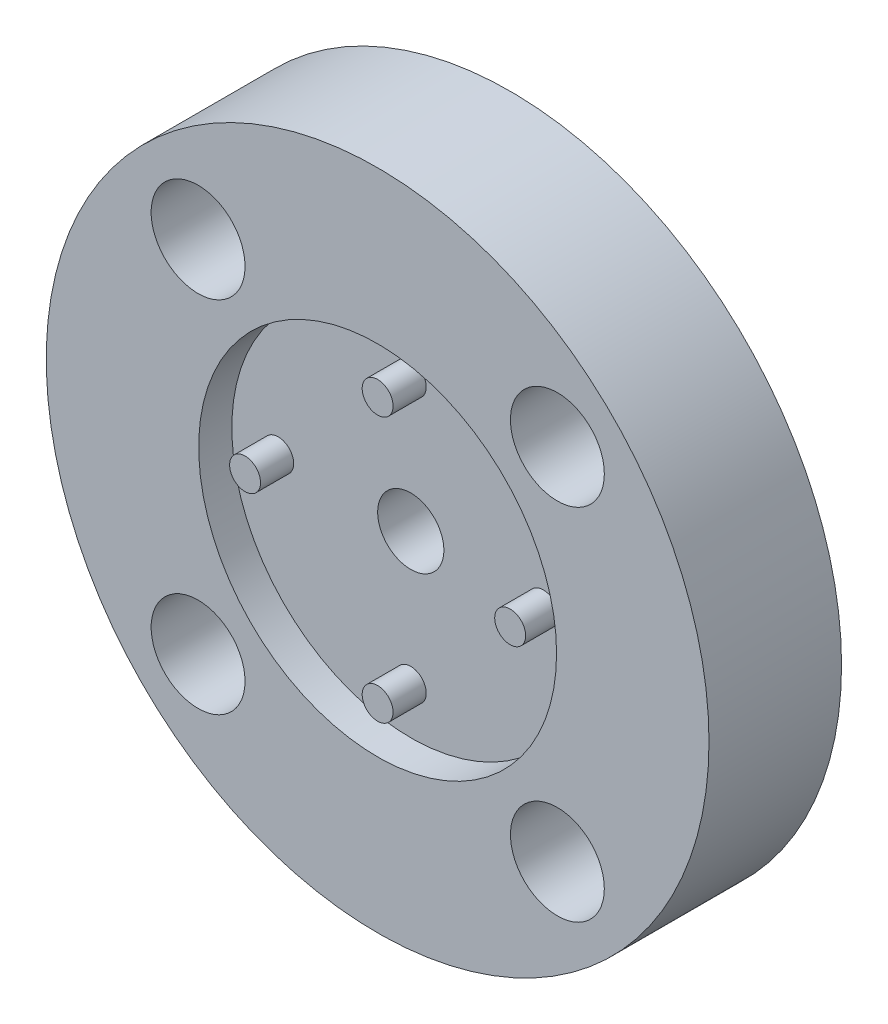
ISO-10303-21;
HEADER;
FILE_DESCRIPTION(('STEP AP214'),'2;1');
FILE_NAME('part.step','',(''),(''),'','','');
FILE_SCHEMA(('AUTOMOTIVE_DESIGN { 1 0 10303 214 1 1 1 1 }'));
ENDSEC;
DATA;
#1=APPLICATION_CONTEXT('core data for automotive mechanical design processes');
#2=APPLICATION_PROTOCOL_DEFINITION('international standard','automotive_design',2000,#1);
#3=PRODUCT_CONTEXT('',#1,'mechanical');
#4=PRODUCT('Part','Part','',(#3));
#5=PRODUCT_RELATED_PRODUCT_CATEGORY('part','',(#4));
#6=PRODUCT_DEFINITION_FORMATION('','',#4);
#7=PRODUCT_DEFINITION_CONTEXT('part definition',#1,'design');
#8=PRODUCT_DEFINITION('design','',#6,#7);
#9=PRODUCT_DEFINITION_SHAPE('','',#8);
#10=(LENGTH_UNIT() NAMED_UNIT(*) SI_UNIT(.MILLI.,.METRE.));
#11=(NAMED_UNIT(*) PLANE_ANGLE_UNIT() SI_UNIT($,.RADIAN.));
#12=(NAMED_UNIT(*) SI_UNIT($,.STERADIAN.) SOLID_ANGLE_UNIT());
#13=UNCERTAINTY_MEASURE_WITH_UNIT(LENGTH_MEASURE(1.E-05),#10,'distance_accuracy_value','');
#14=(GEOMETRIC_REPRESENTATION_CONTEXT(3) GLOBAL_UNCERTAINTY_ASSIGNED_CONTEXT((#13)) GLOBAL_UNIT_ASSIGNED_CONTEXT((#10,
#11,#12)) REPRESENTATION_CONTEXT('',''));
#15=CARTESIAN_POINT('',(0.,0.,0.));
#16=DIRECTION('',(0.,0.,1.));
#17=DIRECTION('',(1.,0.,0.));
#18=AXIS2_PLACEMENT_3D('',#15,#16,#17);
#19=CARTESIAN_POINT('',(0.,0.,6.));
#20=DIRECTION('',(0.,0.,-1.));
#21=DIRECTION('',(-1.,0.,0.));
#22=AXIS2_PLACEMENT_3D('',#19,#20,#21);
#23=CYLINDRICAL_SURFACE('',#22,1.5);
#24=CARTESIAN_POINT('',(0.,0.,4.5));
#25=DIRECTION('',(0.,0.,1.));
#26=DIRECTION('',(1.,0.,0.));
#27=AXIS2_PLACEMENT_3D('',#24,#25,#26);
#28=CIRCLE('',#27,1.5);
#29=CARTESIAN_POINT('',(1.5,0.,4.5));
#30=VERTEX_POINT('',#29);
#31=EDGE_CURVE('E55',#30,#30,#28,.T.);
#32=ORIENTED_EDGE('',*,*,#31,.T.);
#33=EDGE_LOOP('',(#32));
#34=FACE_BOUND('',#33,.T.);
#35=CARTESIAN_POINT('',(0.,0.,2.));
#36=DIRECTION('',(0.,0.,-1.));
#37=DIRECTION('',(-1.,0.,0.));
#38=AXIS2_PLACEMENT_3D('',#35,#36,#37);
#39=CIRCLE('',#38,1.5);
#40=CARTESIAN_POINT('',(-1.5,0.,2.));
#41=VERTEX_POINT('',#40);
#42=EDGE_CURVE('E38',#41,#41,#39,.T.);
#43=ORIENTED_EDGE('',*,*,#42,.T.);
#44=EDGE_LOOP('',(#43));
#45=FACE_BOUND('',#44,.T.);
#46=ADVANCED_FACE('F35',(#34,#45),#23,.F.);
#47=CARTESIAN_POINT('',(8.13652783742947,8.12692529501381,6.));
#48=DIRECTION('',(0.,0.,-1.));
#49=DIRECTION('',(-1.,0.,0.));
#50=AXIS2_PLACEMENT_3D('',#47,#48,#49);
#51=CYLINDRICAL_SURFACE('',#50,2.125);
#52=CARTESIAN_POINT('',(8.13652783742947,8.12692529501381,6.));
#53=DIRECTION('',(0.,0.,1.));
#54=DIRECTION('',(1.,0.,0.));
#55=AXIS2_PLACEMENT_3D('',#52,#53,#54);
#56=CIRCLE('',#55,2.125);
#57=CARTESIAN_POINT('',(10.2615278374295,8.12692529501381,6.));
#58=VERTEX_POINT('',#57);
#59=EDGE_CURVE('E42',#58,#58,#56,.T.);
#60=ORIENTED_EDGE('',*,*,#59,.T.);
#61=EDGE_LOOP('',(#60));
#62=FACE_BOUND('',#61,.T.);
#63=CARTESIAN_POINT('',(8.13652783742947,8.12692529501381,0.));
#64=DIRECTION('',(0.,0.,1.));
#65=DIRECTION('',(1.,0.,0.));
#66=AXIS2_PLACEMENT_3D('',#63,#64,#65);
#67=CIRCLE('',#66,2.125);
#68=CARTESIAN_POINT('',(10.2615278374295,8.12692529501381,0.));
#69=VERTEX_POINT('',#68);
#70=EDGE_CURVE('E61',#69,#69,#67,.T.);
#71=ORIENTED_EDGE('',*,*,#70,.F.);
#72=EDGE_LOOP('',(#71));
#73=FACE_BOUND('',#72,.T.);
#74=ADVANCED_FACE('F118',(#62,#73),#51,.F.);
#75=CARTESIAN_POINT('',(8.13652783742946,-8.13653067227646,6.));
#76=DIRECTION('',(0.,0.,-1.));
#77=DIRECTION('',(-1.,0.,0.));
#78=AXIS2_PLACEMENT_3D('',#75,#76,#77);
#79=CYLINDRICAL_SURFACE('',#78,2.125);
#80=CARTESIAN_POINT('',(8.13652783742946,-8.13653067227646,6.));
#81=DIRECTION('',(0.,0.,1.));
#82=DIRECTION('',(1.,0.,0.));
#83=AXIS2_PLACEMENT_3D('',#80,#81,#82);
#84=CIRCLE('',#83,2.125);
#85=CARTESIAN_POINT('',(10.2615278374295,-8.13653067227646,6.));
#86=VERTEX_POINT('',#85);
#87=EDGE_CURVE('E47',#86,#86,#84,.T.);
#88=ORIENTED_EDGE('',*,*,#87,.T.);
#89=EDGE_LOOP('',(#88));
#90=FACE_BOUND('',#89,.T.);
#91=CARTESIAN_POINT('',(8.13652783742946,-8.13653067227646,0.));
#92=DIRECTION('',(0.,0.,1.));
#93=DIRECTION('',(1.,0.,0.));
#94=AXIS2_PLACEMENT_3D('',#91,#92,#93);
#95=CIRCLE('',#94,2.125);
#96=CARTESIAN_POINT('',(10.2615278374295,-8.13653067227646,0.));
#97=VERTEX_POINT('',#96);
#98=EDGE_CURVE('E58',#97,#97,#95,.T.);
#99=ORIENTED_EDGE('',*,*,#98,.F.);
#100=EDGE_LOOP('',(#99));
#101=FACE_BOUND('',#100,.T.);
#102=ADVANCED_FACE('F104',(#90,#101),#79,.F.);
#103=CARTESIAN_POINT('',(-8.1269281298608,-8.13653067227646,6.));
#104=DIRECTION('',(0.,0.,-1.));
#105=DIRECTION('',(-1.,0.,0.));
#106=AXIS2_PLACEMENT_3D('',#103,#104,#105);
#107=CYLINDRICAL_SURFACE('',#106,2.125);
#108=CARTESIAN_POINT('',(-8.1269281298608,-8.13653067227646,6.));
#109=DIRECTION('',(0.,0.,1.));
#110=DIRECTION('',(1.,0.,0.));
#111=AXIS2_PLACEMENT_3D('',#108,#109,#110);
#112=CIRCLE('',#111,2.125);
#113=CARTESIAN_POINT('',(-6.0019281298608,-8.13653067227646,6.));
#114=VERTEX_POINT('',#113);
#115=EDGE_CURVE('E99',#114,#114,#112,.T.);
#116=ORIENTED_EDGE('',*,*,#115,.T.);
#117=EDGE_LOOP('',(#116));
#118=FACE_BOUND('',#117,.T.);
#119=CARTESIAN_POINT('',(-8.1269281298608,-8.13653067227646,0.));
#120=DIRECTION('',(0.,0.,1.));
#121=DIRECTION('',(1.,0.,0.));
#122=AXIS2_PLACEMENT_3D('',#119,#120,#121);
#123=CIRCLE('',#122,2.125);
#124=CARTESIAN_POINT('',(-6.0019281298608,-8.13653067227646,0.));
#125=VERTEX_POINT('',#124);
#126=EDGE_CURVE('E54',#125,#125,#123,.T.);
#127=ORIENTED_EDGE('',*,*,#126,.F.);
#128=EDGE_LOOP('',(#127));
#129=FACE_BOUND('',#128,.T.);
#130=ADVANCED_FACE('F138',(#118,#129),#107,.F.);
#131=CARTESIAN_POINT('',(-8.1269281298608,8.12692529501381,6.));
#132=DIRECTION('',(0.,0.,-1.));
#133=DIRECTION('',(-1.,0.,0.));
#134=AXIS2_PLACEMENT_3D('',#131,#132,#133);
#135=CYLINDRICAL_SURFACE('',#134,2.125);
#136=CARTESIAN_POINT('',(-8.1269281298608,8.12692529501381,6.));
#137=DIRECTION('',(0.,0.,1.));
#138=DIRECTION('',(1.,0.,0.));
#139=AXIS2_PLACEMENT_3D('',#136,#137,#138);
#140=CIRCLE('',#139,2.125);
#141=CARTESIAN_POINT('',(-6.0019281298608,8.12692529501381,6.));
#142=VERTEX_POINT('',#141);
#143=EDGE_CURVE('E66',#142,#142,#140,.T.);
#144=ORIENTED_EDGE('',*,*,#143,.T.);
#145=EDGE_LOOP('',(#144));
#146=FACE_BOUND('',#145,.T.);
#147=CARTESIAN_POINT('',(-8.1269281298608,8.12692529501381,0.));
#148=DIRECTION('',(0.,0.,1.));
#149=DIRECTION('',(1.,0.,0.));
#150=AXIS2_PLACEMENT_3D('',#147,#148,#149);
#151=CIRCLE('',#150,2.125);
#152=CARTESIAN_POINT('',(-6.0019281298608,8.12692529501381,0.));
#153=VERTEX_POINT('',#152);
#154=EDGE_CURVE('E51',#153,#153,#151,.T.);
#155=ORIENTED_EDGE('',*,*,#154,.F.);
#156=EDGE_LOOP('',(#155));
#157=FACE_BOUND('',#156,.T.);
#158=ADVANCED_FACE('F132',(#146,#157),#135,.F.);
#159=CARTESIAN_POINT('',(0.,0.,6.));
#160=DIRECTION('',(0.,0.,-1.));
#161=DIRECTION('',(-1.,0.,0.));
#162=AXIS2_PLACEMENT_3D('',#159,#160,#161);
#163=CYLINDRICAL_SURFACE('',#162,15.);
#164=CARTESIAN_POINT('',(0.,0.,6.));
#165=DIRECTION('',(0.,0.,1.));
#166=DIRECTION('',(1.,0.,0.));
#167=AXIS2_PLACEMENT_3D('',#164,#165,#166);
#168=CIRCLE('',#167,15.);
#169=CARTESIAN_POINT('',(15.,0.,6.));
#170=VERTEX_POINT('',#169);
#171=EDGE_CURVE('E10',#170,#170,#168,.T.);
#172=ORIENTED_EDGE('',*,*,#171,.F.);
#173=EDGE_LOOP('',(#172));
#174=FACE_BOUND('',#173,.T.);
#175=CARTESIAN_POINT('',(0.,0.,0.));
#176=DIRECTION('',(0.,0.,1.));
#177=DIRECTION('',(1.,0.,0.));
#178=AXIS2_PLACEMENT_3D('',#175,#176,#177);
#179=CIRCLE('',#178,15.);
#180=CARTESIAN_POINT('',(15.,0.,0.));
#181=VERTEX_POINT('',#180);
#182=EDGE_CURVE('E64',#181,#181,#179,.T.);
#183=ORIENTED_EDGE('',*,*,#182,.T.);
#184=EDGE_LOOP('',(#183));
#185=FACE_BOUND('',#184,.T.);
#186=ADVANCED_FACE('F111',(#174,#185),#163,.T.);
#187=CARTESIAN_POINT('',(0.,0.,6.));
#188=DIRECTION('',(0.,0.,1.));
#189=DIRECTION('',(1.,0.,0.));
#190=AXIS2_PLACEMENT_3D('',#187,#188,#189);
#191=PLANE('',#190);
#192=CARTESIAN_POINT('',(0.,0.,6.));
#193=DIRECTION('',(0.,0.,1.));
#194=DIRECTION('',(1.,0.,0.));
#195=AXIS2_PLACEMENT_3D('',#192,#193,#194);
#196=CIRCLE('',#195,8.1);
#197=CARTESIAN_POINT('',(8.1,0.,6.));
#198=VERTEX_POINT('',#197);
#199=EDGE_CURVE('E93',#198,#198,#196,.T.);
#200=ORIENTED_EDGE('',*,*,#199,.F.);
#201=EDGE_LOOP('',(#200));
#202=FACE_BOUND('',#201,.T.);
#203=ORIENTED_EDGE('',*,*,#143,.F.);
#204=EDGE_LOOP('',(#203));
#205=FACE_BOUND('',#204,.T.);
#206=ORIENTED_EDGE('',*,*,#115,.F.);
#207=EDGE_LOOP('',(#206));
#208=FACE_BOUND('',#207,.T.);
#209=ORIENTED_EDGE('',*,*,#87,.F.);
#210=EDGE_LOOP('',(#209));
#211=FACE_BOUND('',#210,.T.);
#212=ORIENTED_EDGE('',*,*,#59,.F.);
#213=EDGE_LOOP('',(#212));
#214=FACE_BOUND('',#213,.T.);
#215=ORIENTED_EDGE('',*,*,#171,.T.);
#216=EDGE_LOOP('',(#215));
#217=FACE_BOUND('',#216,.T.);
#218=ADVANCED_FACE('F107',(#202,#205,#208,#211,#214,#217),#191,.T.);
#219=CARTESIAN_POINT('',(0.,0.,0.));
#220=DIRECTION('',(0.,0.,1.));
#221=DIRECTION('',(1.,0.,0.));
#222=AXIS2_PLACEMENT_3D('',#219,#220,#221);
#223=PLANE('',#222);
#224=CARTESIAN_POINT('',(0.,0.,0.));
#225=DIRECTION('',(0.,0.,-1.));
#226=DIRECTION('',(-1.,0.,0.));
#227=AXIS2_PLACEMENT_3D('',#224,#225,#226);
#228=CIRCLE('',#227,3.);
#229=CARTESIAN_POINT('',(-3.,0.,0.));
#230=VERTEX_POINT('',#229);
#231=EDGE_CURVE('E149',#230,#230,#228,.T.);
#232=ORIENTED_EDGE('',*,*,#231,.F.);
#233=EDGE_LOOP('',(#232));
#234=FACE_BOUND('',#233,.T.);
#235=ORIENTED_EDGE('',*,*,#154,.T.);
#236=EDGE_LOOP('',(#235));
#237=FACE_BOUND('',#236,.T.);
#238=ORIENTED_EDGE('',*,*,#126,.T.);
#239=EDGE_LOOP('',(#238));
#240=FACE_BOUND('',#239,.T.);
#241=ORIENTED_EDGE('',*,*,#98,.T.);
#242=EDGE_LOOP('',(#241));
#243=FACE_BOUND('',#242,.T.);
#244=ORIENTED_EDGE('',*,*,#70,.T.);
#245=EDGE_LOOP('',(#244));
#246=FACE_BOUND('',#245,.T.);
#247=ORIENTED_EDGE('',*,*,#182,.F.);
#248=EDGE_LOOP('',(#247));
#249=FACE_BOUND('',#248,.T.);
#250=ADVANCED_FACE('F110',(#234,#237,#240,#243,#246,#249),#223,.F.);
#251=CARTESIAN_POINT('',(-5.99999999999983,-1.7016286254268E-13,4.5));
#252=DIRECTION('',(0.,0.,1.));
#253=DIRECTION('',(1.,0.,0.));
#254=AXIS2_PLACEMENT_3D('',#251,#252,#253);
#255=CYLINDRICAL_SURFACE('',#254,0.7);
#256=CARTESIAN_POINT('',(-5.99999999999983,-1.7016286254268E-13,4.5));
#257=DIRECTION('',(0.,0.,1.));
#258=DIRECTION('',(1.,0.,0.));
#259=AXIS2_PLACEMENT_3D('',#256,#257,#258);
#260=CIRCLE('',#259,0.7);
#261=CARTESIAN_POINT('',(-5.29999999999983,-1.7016286254268E-13,4.5));
#262=VERTEX_POINT('',#261);
#263=EDGE_CURVE('E72',#262,#262,#260,.T.);
#264=ORIENTED_EDGE('',*,*,#263,.T.);
#265=EDGE_LOOP('',(#264));
#266=FACE_BOUND('',#265,.T.);
#267=CARTESIAN_POINT('',(-5.99999999999983,-1.7016286254268E-13,6.));
#268=DIRECTION('',(0.,0.,1.));
#269=DIRECTION('',(1.,0.,0.));
#270=AXIS2_PLACEMENT_3D('',#267,#268,#269);
#271=CIRCLE('',#270,0.7);
#272=CARTESIAN_POINT('',(-5.29999999999983,-1.7016286254268E-13,6.));
#273=VERTEX_POINT('',#272);
#274=EDGE_CURVE('E90',#273,#273,#271,.T.);
#275=ORIENTED_EDGE('',*,*,#274,.F.);
#276=EDGE_LOOP('',(#275));
#277=FACE_BOUND('',#276,.T.);
#278=ADVANCED_FACE('F126',(#266,#277),#255,.T.);
#279=CARTESIAN_POINT('',(3.38856148926383E-13,-6.,4.5));
#280=DIRECTION('',(0.,0.,1.));
#281=DIRECTION('',(1.,0.,0.));
#282=AXIS2_PLACEMENT_3D('',#279,#280,#281);
#283=CYLINDRICAL_SURFACE('',#282,0.7);
#284=CARTESIAN_POINT('',(3.38856148926383E-13,-6.,4.5));
#285=DIRECTION('',(0.,0.,1.));
#286=DIRECTION('',(1.,0.,0.));
#287=AXIS2_PLACEMENT_3D('',#284,#285,#286);
#288=CIRCLE('',#287,0.7);
#289=CARTESIAN_POINT('',(0.700000000000339,-6.,4.5));
#290=VERTEX_POINT('',#289);
#291=EDGE_CURVE('E77',#290,#290,#288,.T.);
#292=ORIENTED_EDGE('',*,*,#291,.T.);
#293=EDGE_LOOP('',(#292));
#294=FACE_BOUND('',#293,.T.);
#295=CARTESIAN_POINT('',(3.38856148926383E-13,-6.,6.));
#296=DIRECTION('',(0.,0.,1.));
#297=DIRECTION('',(1.,0.,0.));
#298=AXIS2_PLACEMENT_3D('',#295,#296,#297);
#299=CIRCLE('',#298,0.7);
#300=CARTESIAN_POINT('',(0.700000000000339,-6.,6.));
#301=VERTEX_POINT('',#300);
#302=EDGE_CURVE('E87',#301,#301,#299,.T.);
#303=ORIENTED_EDGE('',*,*,#302,.F.);
#304=EDGE_LOOP('',(#303));
#305=FACE_BOUND('',#304,.T.);
#306=ADVANCED_FACE('F163',(#294,#305),#283,.T.);
#307=CARTESIAN_POINT('',(6.00000000000017,1.69428074463191E-13,4.5));
#308=DIRECTION('',(0.,0.,1.));
#309=DIRECTION('',(1.,0.,0.));
#310=AXIS2_PLACEMENT_3D('',#307,#308,#309);
#311=CYLINDRICAL_SURFACE('',#310,0.7);
#312=CARTESIAN_POINT('',(6.00000000000017,1.69428074463191E-13,4.5));
#313=DIRECTION('',(0.,0.,1.));
#314=DIRECTION('',(1.,0.,0.));
#315=AXIS2_PLACEMENT_3D('',#312,#313,#314);
#316=CIRCLE('',#315,0.7);
#317=CARTESIAN_POINT('',(6.70000000000017,1.69428074463191E-13,4.5));
#318=VERTEX_POINT('',#317);
#319=EDGE_CURVE('E158',#318,#318,#316,.T.);
#320=ORIENTED_EDGE('',*,*,#319,.T.);
#321=EDGE_LOOP('',(#320));
#322=FACE_BOUND('',#321,.T.);
#323=CARTESIAN_POINT('',(6.00000000000017,1.69428074463191E-13,6.));
#324=DIRECTION('',(0.,0.,1.));
#325=DIRECTION('',(1.,0.,0.));
#326=AXIS2_PLACEMENT_3D('',#323,#324,#325);
#327=CIRCLE('',#326,0.7);
#328=CARTESIAN_POINT('',(6.70000000000017,1.69428074463191E-13,6.));
#329=VERTEX_POINT('',#328);
#330=EDGE_CURVE('E84',#329,#329,#327,.T.);
#331=ORIENTED_EDGE('',*,*,#330,.F.);
#332=EDGE_LOOP('',(#331));
#333=FACE_BOUND('',#332,.T.);
#334=ADVANCED_FACE('F195',(#322,#333),#311,.T.);
#335=CARTESIAN_POINT('',(0.,6.,4.5));
#336=DIRECTION('',(0.,0.,1.));
#337=DIRECTION('',(1.,0.,0.));
#338=AXIS2_PLACEMENT_3D('',#335,#336,#337);
#339=CYLINDRICAL_SURFACE('',#338,0.7);
#340=CARTESIAN_POINT('',(0.,6.,4.5));
#341=DIRECTION('',(0.,0.,1.));
#342=DIRECTION('',(1.,0.,0.));
#343=AXIS2_PLACEMENT_3D('',#340,#341,#342);
#344=CIRCLE('',#343,0.7);
#345=CARTESIAN_POINT('',(0.7,6.,4.5));
#346=VERTEX_POINT('',#345);
#347=EDGE_CURVE('E96',#346,#346,#344,.T.);
#348=ORIENTED_EDGE('',*,*,#347,.T.);
#349=EDGE_LOOP('',(#348));
#350=FACE_BOUND('',#349,.T.);
#351=CARTESIAN_POINT('',(0.,6.,6.));
#352=DIRECTION('',(0.,0.,1.));
#353=DIRECTION('',(1.,0.,0.));
#354=AXIS2_PLACEMENT_3D('',#351,#352,#353);
#355=CIRCLE('',#354,0.7);
#356=CARTESIAN_POINT('',(0.7,6.,6.));
#357=VERTEX_POINT('',#356);
#358=EDGE_CURVE('E81',#357,#357,#355,.T.);
#359=ORIENTED_EDGE('',*,*,#358,.F.);
#360=EDGE_LOOP('',(#359));
#361=FACE_BOUND('',#360,.T.);
#362=ADVANCED_FACE('F192',(#350,#361),#339,.T.);
#363=CARTESIAN_POINT('',(0.,0.,4.5));
#364=DIRECTION('',(0.,0.,1.));
#365=DIRECTION('',(1.,0.,0.));
#366=AXIS2_PLACEMENT_3D('',#363,#364,#365);
#367=CYLINDRICAL_SURFACE('',#366,8.1);
#368=CARTESIAN_POINT('',(0.,0.,4.5));
#369=DIRECTION('',(0.,0.,1.));
#370=DIRECTION('',(1.,0.,0.));
#371=AXIS2_PLACEMENT_3D('',#368,#369,#370);
#372=CIRCLE('',#371,8.1);
#373=CARTESIAN_POINT('',(8.1,0.,4.5));
#374=VERTEX_POINT('',#373);
#375=EDGE_CURVE('E68',#374,#374,#372,.T.);
#376=ORIENTED_EDGE('',*,*,#375,.F.);
#377=EDGE_LOOP('',(#376));
#378=FACE_BOUND('',#377,.T.);
#379=ORIENTED_EDGE('',*,*,#199,.T.);
#380=EDGE_LOOP('',(#379));
#381=FACE_BOUND('',#380,.T.);
#382=ADVANCED_FACE('F169',(#378,#381),#367,.F.);
#383=CARTESIAN_POINT('',(0.,0.,4.5));
#384=DIRECTION('',(0.,0.,1.));
#385=DIRECTION('',(1.,0.,0.));
#386=AXIS2_PLACEMENT_3D('',#383,#384,#385);
#387=PLANE('',#386);
#388=ORIENTED_EDGE('',*,*,#31,.F.);
#389=EDGE_LOOP('',(#388));
#390=FACE_BOUND('',#389,.T.);
#391=ORIENTED_EDGE('',*,*,#347,.F.);
#392=EDGE_LOOP('',(#391));
#393=FACE_BOUND('',#392,.T.);
#394=ORIENTED_EDGE('',*,*,#319,.F.);
#395=EDGE_LOOP('',(#394));
#396=FACE_BOUND('',#395,.T.);
#397=ORIENTED_EDGE('',*,*,#291,.F.);
#398=EDGE_LOOP('',(#397));
#399=FACE_BOUND('',#398,.T.);
#400=ORIENTED_EDGE('',*,*,#263,.F.);
#401=EDGE_LOOP('',(#400));
#402=FACE_BOUND('',#401,.T.);
#403=ORIENTED_EDGE('',*,*,#375,.T.);
#404=EDGE_LOOP('',(#403));
#405=FACE_BOUND('',#404,.T.);
#406=ADVANCED_FACE('F166',(#390,#393,#396,#399,#402,#405),#387,.T.);
#407=ORIENTED_EDGE('',*,*,#358,.T.);
#408=EDGE_LOOP('',(#407));
#409=FACE_BOUND('',#408,.T.);
#410=ADVANCED_FACE('F115',(#409),#191,.T.);
#411=ORIENTED_EDGE('',*,*,#330,.T.);
#412=EDGE_LOOP('',(#411));
#413=FACE_BOUND('',#412,.T.);
#414=ADVANCED_FACE('F189',(#413),#191,.T.);
#415=ORIENTED_EDGE('',*,*,#302,.T.);
#416=EDGE_LOOP('',(#415));
#417=FACE_BOUND('',#416,.T.);
#418=ADVANCED_FACE('F181',(#417),#191,.T.);
#419=ORIENTED_EDGE('',*,*,#274,.T.);
#420=EDGE_LOOP('',(#419));
#421=FACE_BOUND('',#420,.T.);
#422=ADVANCED_FACE('F114',(#421),#191,.T.);
#423=CARTESIAN_POINT('',(0.,0.,2.));
#424=DIRECTION('',(0.,0.,-1.));
#425=DIRECTION('',(-1.,0.,0.));
#426=AXIS2_PLACEMENT_3D('',#423,#424,#425);
#427=CYLINDRICAL_SURFACE('',#426,3.);
#428=CARTESIAN_POINT('',(0.,0.,2.));
#429=DIRECTION('',(0.,0.,-1.));
#430=DIRECTION('',(-1.,0.,0.));
#431=AXIS2_PLACEMENT_3D('',#428,#429,#430);
#432=CIRCLE('',#431,3.);
#433=CARTESIAN_POINT('',(-3.,0.,2.));
#434=VERTEX_POINT('',#433);
#435=EDGE_CURVE('E147',#434,#434,#432,.T.);
#436=ORIENTED_EDGE('',*,*,#435,.F.);
#437=EDGE_LOOP('',(#436));
#438=FACE_BOUND('',#437,.T.);
#439=ORIENTED_EDGE('',*,*,#231,.T.);
#440=EDGE_LOOP('',(#439));
#441=FACE_BOUND('',#440,.T.);
#442=ADVANCED_FACE('F180',(#438,#441),#427,.F.);
#443=CARTESIAN_POINT('',(0.,0.,2.));
#444=DIRECTION('',(0.,0.,-1.));
#445=DIRECTION('',(-1.,0.,0.));
#446=AXIS2_PLACEMENT_3D('',#443,#444,#445);
#447=PLANE('',#446);
#448=ORIENTED_EDGE('',*,*,#42,.F.);
#449=EDGE_LOOP('',(#448));
#450=FACE_BOUND('',#449,.T.);
#451=ORIENTED_EDGE('',*,*,#435,.T.);
#452=EDGE_LOOP('',(#451));
#453=FACE_BOUND('',#452,.T.);
#454=ADVANCED_FACE('F186',(#450,#453),#447,.T.);
#455=CLOSED_SHELL('',(#46,#74,#102,#130,#158,#186,#218,#250,#278,#306,#334,#362,#382,#406,#410,
#414,#418,#422,#442,#454));
#456=MANIFOLD_SOLID_BREP('B2',#455);
#457=ADVANCED_BREP_SHAPE_REPRESENTATION('',(#18,#456),#14);
#458=SHAPE_DEFINITION_REPRESENTATION(#9,#457);
ENDSEC;
END-ISO-10303-21;
